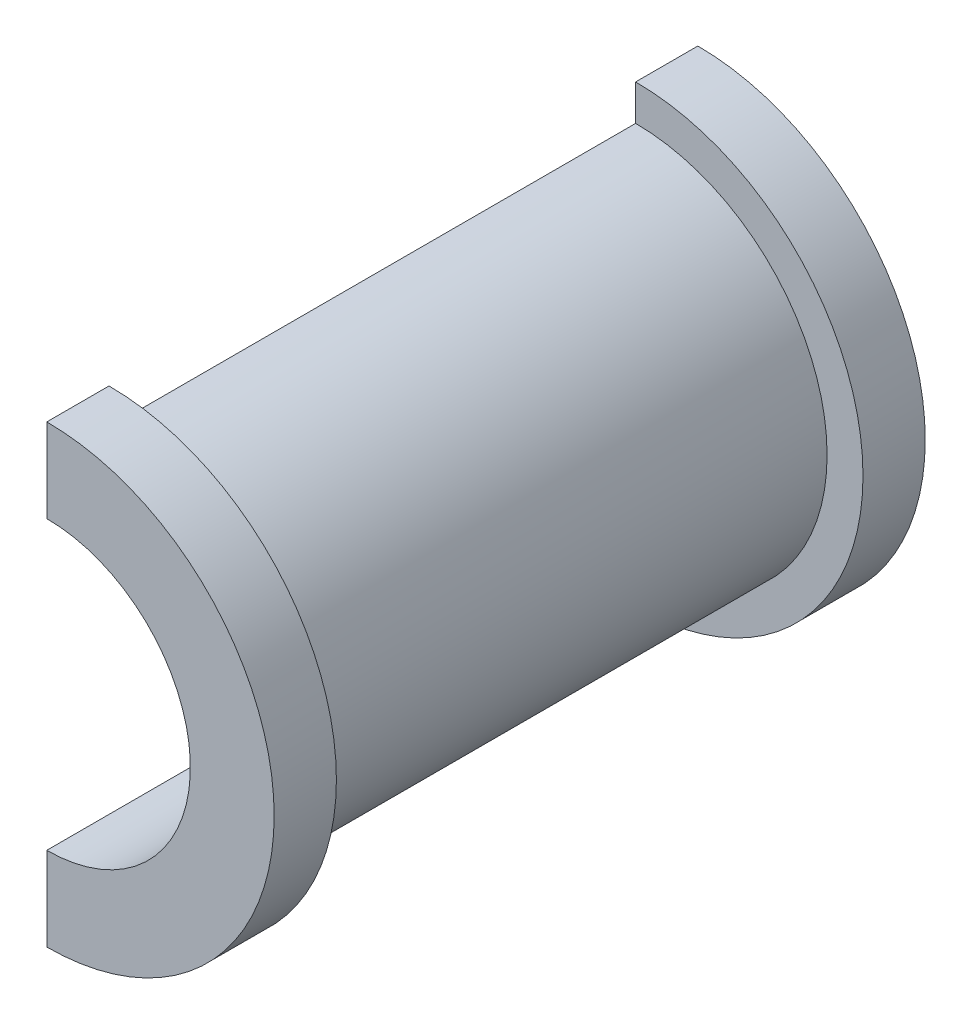
ISO-10303-21;
HEADER;
FILE_DESCRIPTION(('STEP AP214'),'2;1');
FILE_NAME('part.step','',(''),(''),'','','');
FILE_SCHEMA(('AUTOMOTIVE_DESIGN { 1 0 10303 214 1 1 1 1 }'));
ENDSEC;
DATA;
#1=APPLICATION_CONTEXT('core data for automotive mechanical design processes');
#2=APPLICATION_PROTOCOL_DEFINITION('international standard','automotive_design',2000,#1);
#3=PRODUCT_CONTEXT('',#1,'mechanical');
#4=PRODUCT('Part','Part','',(#3));
#5=PRODUCT_RELATED_PRODUCT_CATEGORY('part','',(#4));
#6=PRODUCT_DEFINITION_FORMATION('','',#4);
#7=PRODUCT_DEFINITION_CONTEXT('part definition',#1,'design');
#8=PRODUCT_DEFINITION('design','',#6,#7);
#9=PRODUCT_DEFINITION_SHAPE('','',#8);
#10=(LENGTH_UNIT() NAMED_UNIT(*) SI_UNIT(.MILLI.,.METRE.));
#11=(NAMED_UNIT(*) PLANE_ANGLE_UNIT() SI_UNIT($,.RADIAN.));
#12=(NAMED_UNIT(*) SI_UNIT($,.STERADIAN.) SOLID_ANGLE_UNIT());
#13=UNCERTAINTY_MEASURE_WITH_UNIT(LENGTH_MEASURE(1.E-05),#10,'distance_accuracy_value','');
#14=(GEOMETRIC_REPRESENTATION_CONTEXT(3) GLOBAL_UNCERTAINTY_ASSIGNED_CONTEXT((#13)) GLOBAL_UNIT_ASSIGNED_CONTEXT((#10,
#11,#12)) REPRESENTATION_CONTEXT('',''));
#15=CARTESIAN_POINT('',(0.,0.,0.));
#16=DIRECTION('',(0.,0.,1.));
#17=DIRECTION('',(1.,0.,0.));
#18=AXIS2_PLACEMENT_3D('',#15,#16,#17);
#19=CARTESIAN_POINT('',(0.,0.,55.));
#20=DIRECTION('',(0.,0.,-1.));
#21=DIRECTION('',(-1.,0.,0.));
#22=AXIS2_PLACEMENT_3D('',#19,#20,#21);
#23=CYLINDRICAL_SURFACE('',#22,30.);
#24=DIRECTION('',(0.,0.,-1.));
#25=VECTOR('',#24,1.);
#26=CARTESIAN_POINT('',(0.,30.,55.));
#27=LINE('',#26,#25);
#28=CARTESIAN_POINT('',(0.,30.,68.));
#29=VERTEX_POINT('',#28);
#30=CARTESIAN_POINT('',(0.,30.,-68.));
#31=VERTEX_POINT('',#30);
#32=EDGE_CURVE('E102',#29,#31,#27,.T.);
#33=ORIENTED_EDGE('',*,*,#32,.T.);
#34=CARTESIAN_POINT('',(0.,0.,-68.));
#35=DIRECTION('',(0.,0.,-1.));
#36=DIRECTION('',(1.,0.,0.));
#37=AXIS2_PLACEMENT_3D('',#34,#35,#36);
#38=CIRCLE('',#37,30.);
#39=CARTESIAN_POINT('',(0.,-30.,-68.));
#40=VERTEX_POINT('',#39);
#41=EDGE_CURVE('E104',#31,#40,#38,.T.);
#42=ORIENTED_EDGE('',*,*,#41,.T.);
#43=DIRECTION('',(0.,0.,-1.));
#44=VECTOR('',#43,1.);
#45=CARTESIAN_POINT('',(0.,-30.,55.));
#46=LINE('',#45,#44);
#47=CARTESIAN_POINT('',(0.,-30.,68.));
#48=VERTEX_POINT('',#47);
#49=EDGE_CURVE('E11',#48,#40,#46,.T.);
#50=ORIENTED_EDGE('',*,*,#49,.F.);
#51=CARTESIAN_POINT('',(0.,0.,68.));
#52=DIRECTION('',(0.,0.,-1.));
#53=DIRECTION('',(1.,0.,0.));
#54=AXIS2_PLACEMENT_3D('',#51,#52,#53);
#55=CIRCLE('',#54,30.);
#56=EDGE_CURVE('E107',#29,#48,#55,.T.);
#57=ORIENTED_EDGE('',*,*,#56,.F.);
#58=EDGE_LOOP('',(#33,#42,#50,#57));
#59=FACE_BOUND('',#58,.T.);
#60=ADVANCED_FACE('F43',(#59),#23,.F.);
#61=CARTESIAN_POINT('',(0.,-30.,55.));
#62=DIRECTION('',(1.,0.,0.));
#63=DIRECTION('',(0.,0.,-1.));
#64=AXIS2_PLACEMENT_3D('',#61,#62,#63);
#65=PLANE('',#64);
#66=ORIENTED_EDGE('',*,*,#49,.T.);
#67=DIRECTION('',(0.,-1.,0.));
#68=VECTOR('',#67,1.);
#69=CARTESIAN_POINT('',(0.,-30.,-68.));
#70=LINE('',#69,#68);
#71=CARTESIAN_POINT('',(0.,-47.5,-68.));
#72=VERTEX_POINT('',#71);
#73=EDGE_CURVE('E122',#40,#72,#70,.T.);
#74=ORIENTED_EDGE('',*,*,#73,.T.);
#75=DIRECTION('',(0.,0.,1.));
#76=VECTOR('',#75,1.);
#77=CARTESIAN_POINT('',(0.,-47.5,-68.));
#78=LINE('',#77,#76);
#79=CARTESIAN_POINT('',(0.,-47.5,-55.));
#80=VERTEX_POINT('',#79);
#81=EDGE_CURVE('E134',#72,#80,#78,.T.);
#82=ORIENTED_EDGE('',*,*,#81,.T.);
#83=DIRECTION('',(0.,-1.,0.));
#84=VECTOR('',#83,1.);
#85=CARTESIAN_POINT('',(0.,-30.,-55.));
#86=LINE('',#85,#84);
#87=CARTESIAN_POINT('',(0.,-40.,-55.));
#88=VERTEX_POINT('',#87);
#89=EDGE_CURVE('E123',#88,#80,#86,.T.);
#90=ORIENTED_EDGE('',*,*,#89,.F.);
#91=DIRECTION('',(0.,0.,-1.));
#92=VECTOR('',#91,1.);
#93=CARTESIAN_POINT('',(0.,-40.,55.));
#94=LINE('',#93,#92);
#95=CARTESIAN_POINT('',(0.,-40.,55.));
#96=VERTEX_POINT('',#95);
#97=EDGE_CURVE('E51',#96,#88,#94,.T.);
#98=ORIENTED_EDGE('',*,*,#97,.F.);
#99=DIRECTION('',(0.,-1.,0.));
#100=VECTOR('',#99,1.);
#101=CARTESIAN_POINT('',(0.,-30.,55.));
#102=LINE('',#101,#100);
#103=CARTESIAN_POINT('',(0.,-47.5,55.));
#104=VERTEX_POINT('',#103);
#105=EDGE_CURVE('E144',#96,#104,#102,.T.);
#106=ORIENTED_EDGE('',*,*,#105,.T.);
#107=DIRECTION('',(0.,0.,-1.));
#108=VECTOR('',#107,1.);
#109=CARTESIAN_POINT('',(0.,-47.5,68.));
#110=LINE('',#109,#108);
#111=CARTESIAN_POINT('',(0.,-47.5,68.));
#112=VERTEX_POINT('',#111);
#113=EDGE_CURVE('E161',#112,#104,#110,.T.);
#114=ORIENTED_EDGE('',*,*,#113,.F.);
#115=DIRECTION('',(0.,-1.,0.));
#116=VECTOR('',#115,1.);
#117=CARTESIAN_POINT('',(0.,-30.,68.));
#118=LINE('',#117,#116);
#119=EDGE_CURVE('E146',#48,#112,#118,.T.);
#120=ORIENTED_EDGE('',*,*,#119,.F.);
#121=EDGE_LOOP('',(#66,#74,#82,#90,#98,#106,#114,#120));
#122=FACE_BOUND('',#121,.T.);
#123=ADVANCED_FACE('F177',(#122),#65,.F.);
#124=CARTESIAN_POINT('',(0.,0.,55.));
#125=DIRECTION('',(0.,0.,-1.));
#126=DIRECTION('',(-1.,0.,0.));
#127=AXIS2_PLACEMENT_3D('',#124,#125,#126);
#128=CYLINDRICAL_SURFACE('',#127,40.);
#129=CARTESIAN_POINT('',(0.,0.,-55.));
#130=DIRECTION('',(0.,0.,1.));
#131=DIRECTION('',(-1.,0.,0.));
#132=AXIS2_PLACEMENT_3D('',#129,#130,#131);
#133=CIRCLE('',#132,40.);
#134=CARTESIAN_POINT('',(0.,40.,-55.));
#135=VERTEX_POINT('',#134);
#136=EDGE_CURVE('E164',#88,#135,#133,.T.);
#137=ORIENTED_EDGE('',*,*,#136,.T.);
#138=DIRECTION('',(0.,0.,-1.));
#139=VECTOR('',#138,1.);
#140=CARTESIAN_POINT('',(0.,40.,55.));
#141=LINE('',#140,#139);
#142=CARTESIAN_POINT('',(0.,40.,55.));
#143=VERTEX_POINT('',#142);
#144=EDGE_CURVE('E112',#143,#135,#141,.T.);
#145=ORIENTED_EDGE('',*,*,#144,.F.);
#146=CARTESIAN_POINT('',(0.,0.,55.));
#147=DIRECTION('',(0.,0.,1.));
#148=DIRECTION('',(-1.,0.,0.));
#149=AXIS2_PLACEMENT_3D('',#146,#147,#148);
#150=CIRCLE('',#149,40.);
#151=EDGE_CURVE('E113',#96,#143,#150,.T.);
#152=ORIENTED_EDGE('',*,*,#151,.F.);
#153=ORIENTED_EDGE('',*,*,#97,.T.);
#154=EDGE_LOOP('',(#137,#145,#152,#153));
#155=FACE_BOUND('',#154,.T.);
#156=ADVANCED_FACE('F170',(#155),#128,.T.);
#157=CARTESIAN_POINT('',(0.,40.,55.));
#158=DIRECTION('',(1.,0.,0.));
#159=DIRECTION('',(0.,0.,-1.));
#160=AXIS2_PLACEMENT_3D('',#157,#158,#159);
#161=PLANE('',#160);
#162=ORIENTED_EDGE('',*,*,#144,.T.);
#163=DIRECTION('',(0.,-1.,0.));
#164=VECTOR('',#163,1.);
#165=CARTESIAN_POINT('',(0.,47.5,-55.));
#166=LINE('',#165,#164);
#167=CARTESIAN_POINT('',(0.,47.5,-55.));
#168=VERTEX_POINT('',#167);
#169=EDGE_CURVE('E135',#168,#135,#166,.T.);
#170=ORIENTED_EDGE('',*,*,#169,.F.);
#171=DIRECTION('',(0.,0.,1.));
#172=VECTOR('',#171,1.);
#173=CARTESIAN_POINT('',(0.,47.5,-68.));
#174=LINE('',#173,#172);
#175=CARTESIAN_POINT('',(0.,47.5,-68.));
#176=VERTEX_POINT('',#175);
#177=EDGE_CURVE('E128',#176,#168,#174,.T.);
#178=ORIENTED_EDGE('',*,*,#177,.F.);
#179=DIRECTION('',(0.,-1.,0.));
#180=VECTOR('',#179,1.);
#181=CARTESIAN_POINT('',(0.,47.5,-68.));
#182=LINE('',#181,#180);
#183=EDGE_CURVE('E119',#176,#31,#182,.T.);
#184=ORIENTED_EDGE('',*,*,#183,.T.);
#185=ORIENTED_EDGE('',*,*,#32,.F.);
#186=DIRECTION('',(0.,-1.,0.));
#187=VECTOR('',#186,1.);
#188=CARTESIAN_POINT('',(0.,47.5,68.));
#189=LINE('',#188,#187);
#190=CARTESIAN_POINT('',(0.,47.5,68.));
#191=VERTEX_POINT('',#190);
#192=EDGE_CURVE('E151',#191,#29,#189,.T.);
#193=ORIENTED_EDGE('',*,*,#192,.F.);
#194=DIRECTION('',(0.,0.,-1.));
#195=VECTOR('',#194,1.);
#196=CARTESIAN_POINT('',(0.,47.5,68.));
#197=LINE('',#196,#195);
#198=CARTESIAN_POINT('',(0.,47.5,55.));
#199=VERTEX_POINT('',#198);
#200=EDGE_CURVE('E153',#191,#199,#197,.T.);
#201=ORIENTED_EDGE('',*,*,#200,.T.);
#202=DIRECTION('',(0.,-1.,0.));
#203=VECTOR('',#202,1.);
#204=CARTESIAN_POINT('',(0.,47.5,55.));
#205=LINE('',#204,#203);
#206=EDGE_CURVE('E147',#199,#143,#205,.T.);
#207=ORIENTED_EDGE('',*,*,#206,.T.);
#208=EDGE_LOOP('',(#162,#170,#178,#184,#185,#193,#201,#207));
#209=FACE_BOUND('',#208,.T.);
#210=ADVANCED_FACE('F126',(#209),#161,.F.);
#211=CARTESIAN_POINT('',(0.,0.,68.));
#212=DIRECTION('',(0.,0.,-1.));
#213=DIRECTION('',(-1.,0.,0.));
#214=AXIS2_PLACEMENT_3D('',#211,#212,#213);
#215=CYLINDRICAL_SURFACE('',#214,47.5);
#216=CARTESIAN_POINT('',(0.,0.,55.));
#217=DIRECTION('',(0.,0.,1.));
#218=DIRECTION('',(-1.,0.,0.));
#219=AXIS2_PLACEMENT_3D('',#216,#217,#218);
#220=CIRCLE('',#219,47.5);
#221=EDGE_CURVE('E155',#104,#199,#220,.T.);
#222=ORIENTED_EDGE('',*,*,#221,.T.);
#223=ORIENTED_EDGE('',*,*,#200,.F.);
#224=CARTESIAN_POINT('',(0.,0.,68.));
#225=DIRECTION('',(0.,0.,1.));
#226=DIRECTION('',(-1.,0.,0.));
#227=AXIS2_PLACEMENT_3D('',#224,#225,#226);
#228=CIRCLE('',#227,47.5);
#229=EDGE_CURVE('E149',#112,#191,#228,.T.);
#230=ORIENTED_EDGE('',*,*,#229,.F.);
#231=ORIENTED_EDGE('',*,*,#113,.T.);
#232=EDGE_LOOP('',(#222,#223,#230,#231));
#233=FACE_BOUND('',#232,.T.);
#234=ADVANCED_FACE('F181',(#233),#215,.T.);
#235=CARTESIAN_POINT('',(0.,0.,68.));
#236=DIRECTION('',(0.,0.,1.));
#237=DIRECTION('',(1.,0.,0.));
#238=AXIS2_PLACEMENT_3D('',#235,#236,#237);
#239=PLANE('',#238);
#240=ORIENTED_EDGE('',*,*,#56,.T.);
#241=ORIENTED_EDGE('',*,*,#119,.T.);
#242=ORIENTED_EDGE('',*,*,#229,.T.);
#243=ORIENTED_EDGE('',*,*,#192,.T.);
#244=EDGE_LOOP('',(#240,#241,#242,#243));
#245=FACE_BOUND('',#244,.T.);
#246=ADVANCED_FACE('F184',(#245),#239,.T.);
#247=CARTESIAN_POINT('',(0.,0.,55.));
#248=DIRECTION('',(0.,0.,1.));
#249=DIRECTION('',(1.,0.,0.));
#250=AXIS2_PLACEMENT_3D('',#247,#248,#249);
#251=PLANE('',#250);
#252=ORIENTED_EDGE('',*,*,#105,.F.);
#253=ORIENTED_EDGE('',*,*,#151,.T.);
#254=ORIENTED_EDGE('',*,*,#206,.F.);
#255=ORIENTED_EDGE('',*,*,#221,.F.);
#256=EDGE_LOOP('',(#252,#253,#254,#255));
#257=FACE_BOUND('',#256,.T.);
#258=ADVANCED_FACE('F175',(#257),#251,.F.);
#259=CARTESIAN_POINT('',(0.,0.,-68.));
#260=DIRECTION('',(0.,0.,1.));
#261=DIRECTION('',(1.,0.,0.));
#262=AXIS2_PLACEMENT_3D('',#259,#260,#261);
#263=CYLINDRICAL_SURFACE('',#262,47.5);
#264=CARTESIAN_POINT('',(0.,0.,-55.));
#265=DIRECTION('',(0.,0.,1.));
#266=DIRECTION('',(-1.,0.,0.));
#267=AXIS2_PLACEMENT_3D('',#264,#265,#266);
#268=CIRCLE('',#267,47.5);
#269=EDGE_CURVE('E137',#80,#168,#268,.T.);
#270=ORIENTED_EDGE('',*,*,#269,.F.);
#271=ORIENTED_EDGE('',*,*,#81,.F.);
#272=CARTESIAN_POINT('',(0.,0.,-68.));
#273=DIRECTION('',(0.,0.,1.));
#274=DIRECTION('',(-1.,0.,0.));
#275=AXIS2_PLACEMENT_3D('',#272,#273,#274);
#276=CIRCLE('',#275,47.5);
#277=EDGE_CURVE('E129',#72,#176,#276,.T.);
#278=ORIENTED_EDGE('',*,*,#277,.T.);
#279=ORIENTED_EDGE('',*,*,#177,.T.);
#280=EDGE_LOOP('',(#270,#271,#278,#279));
#281=FACE_BOUND('',#280,.T.);
#282=ADVANCED_FACE('F187',(#281),#263,.T.);
#283=CARTESIAN_POINT('',(0.,0.,-68.));
#284=DIRECTION('',(0.,0.,-1.));
#285=DIRECTION('',(1.,0.,0.));
#286=AXIS2_PLACEMENT_3D('',#283,#284,#285);
#287=PLANE('',#286);
#288=ORIENTED_EDGE('',*,*,#41,.F.);
#289=ORIENTED_EDGE('',*,*,#183,.F.);
#290=ORIENTED_EDGE('',*,*,#277,.F.);
#291=ORIENTED_EDGE('',*,*,#73,.F.);
#292=EDGE_LOOP('',(#288,#289,#290,#291));
#293=FACE_BOUND('',#292,.T.);
#294=ADVANCED_FACE('F117',(#293),#287,.T.);
#295=CARTESIAN_POINT('',(0.,0.,-55.));
#296=DIRECTION('',(0.,0.,-1.));
#297=DIRECTION('',(1.,0.,0.));
#298=AXIS2_PLACEMENT_3D('',#295,#296,#297);
#299=PLANE('',#298);
#300=ORIENTED_EDGE('',*,*,#136,.F.);
#301=ORIENTED_EDGE('',*,*,#89,.T.);
#302=ORIENTED_EDGE('',*,*,#269,.T.);
#303=ORIENTED_EDGE('',*,*,#169,.T.);
#304=EDGE_LOOP('',(#300,#301,#302,#303));
#305=FACE_BOUND('',#304,.T.);
#306=ADVANCED_FACE('F189',(#305),#299,.F.);
#307=CLOSED_SHELL('',(#60,#123,#156,#210,#234,#246,#258,#282,#294,#306));
#308=MANIFOLD_SOLID_BREP('B2',#307);
#309=ADVANCED_BREP_SHAPE_REPRESENTATION('',(#18,#308),#14);
#310=SHAPE_DEFINITION_REPRESENTATION(#9,#309);
ENDSEC;
END-ISO-10303-21;
